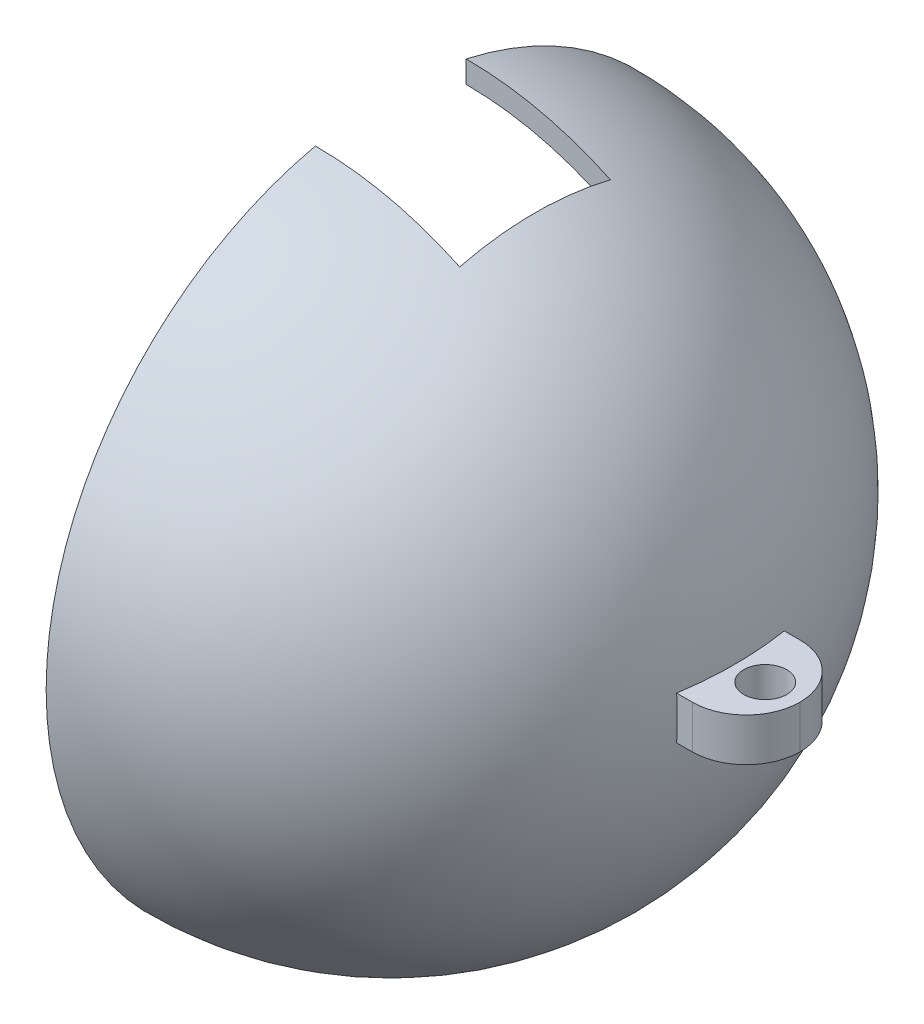
ISO-10303-21;
HEADER;
FILE_DESCRIPTION(('STEP AP214'),'2;1');
FILE_NAME('part.step','',(''),(''),'','','');
FILE_SCHEMA(('AUTOMOTIVE_DESIGN { 1 0 10303 214 1 1 1 1 }'));
ENDSEC;
DATA;
#1=APPLICATION_CONTEXT('core data for automotive mechanical design processes');
#2=APPLICATION_PROTOCOL_DEFINITION('international standard','automotive_design',2000,#1);
#3=PRODUCT_CONTEXT('',#1,'mechanical');
#4=PRODUCT('Part','Part','',(#3));
#5=PRODUCT_RELATED_PRODUCT_CATEGORY('part','',(#4));
#6=PRODUCT_DEFINITION_FORMATION('','',#4);
#7=PRODUCT_DEFINITION_CONTEXT('part definition',#1,'design');
#8=PRODUCT_DEFINITION('design','',#6,#7);
#9=PRODUCT_DEFINITION_SHAPE('','',#8);
#10=(LENGTH_UNIT() NAMED_UNIT(*) SI_UNIT(.MILLI.,.METRE.));
#11=(NAMED_UNIT(*) PLANE_ANGLE_UNIT() SI_UNIT($,.RADIAN.));
#12=(NAMED_UNIT(*) SI_UNIT($,.STERADIAN.) SOLID_ANGLE_UNIT());
#13=UNCERTAINTY_MEASURE_WITH_UNIT(LENGTH_MEASURE(1.E-05),#10,'distance_accuracy_value','');
#14=(GEOMETRIC_REPRESENTATION_CONTEXT(3) GLOBAL_UNCERTAINTY_ASSIGNED_CONTEXT((#13)) GLOBAL_UNIT_ASSIGNED_CONTEXT((#10,
#11,#12)) REPRESENTATION_CONTEXT('',''));
#15=CARTESIAN_POINT('',(0.,0.,0.));
#16=DIRECTION('',(0.,0.,1.));
#17=DIRECTION('',(1.,0.,0.));
#18=AXIS2_PLACEMENT_3D('',#15,#16,#17);
#19=CARTESIAN_POINT('',(0.,0.,0.));
#20=DIRECTION('',(0.,0.,1.));
#21=DIRECTION('',(0.,-1.,0.));
#22=AXIS2_PLACEMENT_3D('',#19,#20,#21);
#23=SPHERICAL_SURFACE('',#22,16.);
#24=CARTESIAN_POINT('',(0.,0.,0.));
#25=DIRECTION('',(-1.,0.,0.));
#26=DIRECTION('',(0.,0.,-1.));
#27=AXIS2_PLACEMENT_3D('',#24,#25,#26);
#28=CIRCLE('',#27,16.);
#29=CARTESIAN_POINT('',(0.,15.612494995996,-3.5));
#30=VERTEX_POINT('',#29);
#31=CARTESIAN_POINT('',(0.,15.612494995996,3.5));
#32=VERTEX_POINT('',#31);
#33=EDGE_CURVE('E131',#30,#32,#28,.T.);
#34=ORIENTED_EDGE('',*,*,#33,.F.);
#35=CARTESIAN_POINT('',(0.,0.,-3.5));
#36=DIRECTION('',(0.,0.,-1.));
#37=DIRECTION('',(-1.,0.,0.));
#38=AXIS2_PLACEMENT_3D('',#35,#36,#37);
#39=CIRCLE('',#38,15.612494995996);
#40=CARTESIAN_POINT('',(6.7,14.1017729381805,-3.5));
#41=VERTEX_POINT('',#40);
#42=EDGE_CURVE('E197',#30,#41,#39,.T.);
#43=ORIENTED_EDGE('',*,*,#42,.T.);
#44=CARTESIAN_POINT('',(6.7,0.,0.));
#45=DIRECTION('',(1.,0.,0.));
#46=DIRECTION('',(0.,0.,-1.));
#47=AXIS2_PLACEMENT_3D('',#44,#45,#46);
#48=CIRCLE('',#47,14.5296249091296);
#49=CARTESIAN_POINT('',(6.7,14.1017729381805,3.5));
#50=VERTEX_POINT('',#49);
#51=EDGE_CURVE('E132',#41,#50,#48,.T.);
#52=ORIENTED_EDGE('',*,*,#51,.T.);
#53=CARTESIAN_POINT('',(0.,0.,3.5));
#54=DIRECTION('',(0.,0.,1.));
#55=DIRECTION('',(1.,0.,0.));
#56=AXIS2_PLACEMENT_3D('',#53,#54,#55);
#57=CIRCLE('',#56,15.612494995996);
#58=EDGE_CURVE('E117',#50,#32,#57,.T.);
#59=ORIENTED_EDGE('',*,*,#58,.T.);
#60=EDGE_LOOP('',(#34,#43,#52,#59));
#61=FACE_BOUND('',#60,.T.);
#62=CARTESIAN_POINT('',(0.,0.,-2.5));
#63=DIRECTION('',(0.,0.,1.));
#64=DIRECTION('',(1.,0.,0.));
#65=AXIS2_PLACEMENT_3D('',#62,#63,#64);
#66=CIRCLE('',#65,15.8034806292791);
#67=CARTESIAN_POINT('',(15.7718102955875,-1.,-2.5));
#68=VERTEX_POINT('',#67);
#69=CARTESIAN_POINT('',(15.7718102955875,1.,-2.5));
#70=VERTEX_POINT('',#69);
#71=EDGE_CURVE('E161',#68,#70,#66,.T.);
#72=ORIENTED_EDGE('',*,*,#71,.F.);
#73=CARTESIAN_POINT('',(0.,-1.,0.));
#74=DIRECTION('',(0.,1.,0.));
#75=DIRECTION('',(0.,0.,1.));
#76=AXIS2_PLACEMENT_3D('',#73,#74,#75);
#77=CIRCLE('',#76,15.9687194226713);
#78=CARTESIAN_POINT('',(15.7718102955875,-1.,2.5));
#79=VERTEX_POINT('',#78);
#80=EDGE_CURVE('E144',#79,#68,#77,.T.);
#81=ORIENTED_EDGE('',*,*,#80,.F.);
#82=CARTESIAN_POINT('',(0.,0.,2.5));
#83=DIRECTION('',(0.,0.,-1.));
#84=DIRECTION('',(-1.,0.,0.));
#85=AXIS2_PLACEMENT_3D('',#82,#83,#84);
#86=CIRCLE('',#85,15.8034806292791);
#87=CARTESIAN_POINT('',(15.7718102955875,1.,2.5));
#88=VERTEX_POINT('',#87);
#89=EDGE_CURVE('E153',#88,#79,#86,.T.);
#90=ORIENTED_EDGE('',*,*,#89,.F.);
#91=CARTESIAN_POINT('',(0.,1.,0.));
#92=DIRECTION('',(0.,-1.,0.));
#93=DIRECTION('',(0.,0.,-1.));
#94=AXIS2_PLACEMENT_3D('',#91,#92,#93);
#95=CIRCLE('',#94,15.9687194226713);
#96=EDGE_CURVE('E157',#70,#88,#95,.T.);
#97=ORIENTED_EDGE('',*,*,#96,.F.);
#98=EDGE_LOOP('',(#72,#81,#90,#97));
#99=FACE_BOUND('',#98,.T.);
#100=ADVANCED_FACE('F40',(#61,#99),#23,.T.);
#101=CARTESIAN_POINT('',(0.,0.,0.));
#102=DIRECTION('',(0.,0.,1.));
#103=DIRECTION('',(0.,-1.,0.));
#104=AXIS2_PLACEMENT_3D('',#101,#102,#103);
#105=SPHERICAL_SURFACE('',#104,15.);
#106=CARTESIAN_POINT('',(15.,0.,0.));
#107=VERTEX_POINT('',#106);
#108=VERTEX_LOOP('',#107);
#109=FACE_BOUND('',#108,.T.);
#110=CARTESIAN_POINT('',(6.7,0.,0.));
#111=DIRECTION('',(1.,0.,0.));
#112=DIRECTION('',(0.,0.,-1.));
#113=AXIS2_PLACEMENT_3D('',#110,#111,#112);
#114=CIRCLE('',#113,13.4205066968427);
#115=CARTESIAN_POINT('',(6.7,12.9560796539694,3.5));
#116=VERTEX_POINT('',#115);
#117=CARTESIAN_POINT('',(6.7,12.9560796539694,-3.5));
#118=VERTEX_POINT('',#117);
#119=EDGE_CURVE('E12',#116,#118,#114,.F.);
#120=ORIENTED_EDGE('',*,*,#119,.T.);
#121=CARTESIAN_POINT('',(0.,0.,-3.5));
#122=DIRECTION('',(0.,0.,-1.));
#123=DIRECTION('',(-1.,0.,0.));
#124=AXIS2_PLACEMENT_3D('',#121,#122,#123);
#125=CIRCLE('',#124,14.5859521458148);
#126=CARTESIAN_POINT('',(0.,14.5859521458148,-3.5));
#127=VERTEX_POINT('',#126);
#128=EDGE_CURVE('E134',#118,#127,#125,.F.);
#129=ORIENTED_EDGE('',*,*,#128,.T.);
#130=CARTESIAN_POINT('',(0.,0.,0.));
#131=DIRECTION('',(1.,0.,0.));
#132=DIRECTION('',(0.,0.,-1.));
#133=AXIS2_PLACEMENT_3D('',#130,#131,#132);
#134=CIRCLE('',#133,15.);
#135=CARTESIAN_POINT('',(1.01853159452743E-13,14.5859521458148,3.5));
#136=VERTEX_POINT('',#135);
#137=EDGE_CURVE('E139',#136,#127,#134,.T.);
#138=ORIENTED_EDGE('',*,*,#137,.F.);
#139=CARTESIAN_POINT('',(0.,0.,3.5));
#140=DIRECTION('',(0.,0.,1.));
#141=DIRECTION('',(1.,0.,0.));
#142=AXIS2_PLACEMENT_3D('',#139,#140,#141);
#143=CIRCLE('',#142,14.5859521458148);
#144=EDGE_CURVE('E56',#136,#116,#143,.F.);
#145=ORIENTED_EDGE('',*,*,#144,.T.);
#146=EDGE_LOOP('',(#120,#129,#138,#145));
#147=FACE_BOUND('',#146,.T.);
#148=ADVANCED_FACE('F199',(#109,#147),#105,.F.);
#149=CARTESIAN_POINT('',(0.,0.,0.));
#150=DIRECTION('',(-1.,0.,0.));
#151=DIRECTION('',(0.,0.,-1.));
#152=AXIS2_PLACEMENT_3D('',#149,#150,#151);
#153=PLANE('',#152);
#154=DIRECTION('',(0.,-1.,0.));
#155=VECTOR('',#154,1.);
#156=CARTESIAN_POINT('',(0.,0.,-3.5));
#157=LINE('',#156,#155);
#158=EDGE_CURVE('E49',#30,#127,#157,.T.);
#159=ORIENTED_EDGE('',*,*,#158,.F.);
#160=ORIENTED_EDGE('',*,*,#33,.T.);
#161=DIRECTION('',(0.,1.,0.));
#162=VECTOR('',#161,1.);
#163=CARTESIAN_POINT('',(0.,0.,3.5));
#164=LINE('',#163,#162);
#165=EDGE_CURVE('E114',#136,#32,#164,.T.);
#166=ORIENTED_EDGE('',*,*,#165,.F.);
#167=ORIENTED_EDGE('',*,*,#137,.T.);
#168=EDGE_LOOP('',(#159,#160,#166,#167));
#169=FACE_BOUND('',#168,.T.);
#170=ADVANCED_FACE('F137',(#169),#153,.T.);
#171=CARTESIAN_POINT('',(19.,-1.,-2.5));
#172=DIRECTION('',(0.,0.,1.));
#173=DIRECTION('',(1.,0.,0.));
#174=AXIS2_PLACEMENT_3D('',#171,#172,#173);
#175=PLANE('',#174);
#176=DIRECTION('',(-1.,0.,0.));
#177=VECTOR('',#176,1.);
#178=CARTESIAN_POINT('',(19.,1.,-2.5));
#179=LINE('',#178,#177);
#180=CARTESIAN_POINT('',(16.5,1.,-2.5));
#181=VERTEX_POINT('',#180);
#182=EDGE_CURVE('E140',#181,#70,#179,.T.);
#183=ORIENTED_EDGE('',*,*,#182,.F.);
#184=DIRECTION('',(0.,1.,0.));
#185=VECTOR('',#184,1.);
#186=CARTESIAN_POINT('',(16.5,-1.,-2.5));
#187=LINE('',#186,#185);
#188=CARTESIAN_POINT('',(16.5,-1.,-2.5));
#189=VERTEX_POINT('',#188);
#190=EDGE_CURVE('E178',#181,#189,#187,.F.);
#191=ORIENTED_EDGE('',*,*,#190,.T.);
#192=DIRECTION('',(-1.,0.,0.));
#193=VECTOR('',#192,1.);
#194=CARTESIAN_POINT('',(19.,-1.,-2.5));
#195=LINE('',#194,#193);
#196=EDGE_CURVE('E170',#189,#68,#195,.T.);
#197=ORIENTED_EDGE('',*,*,#196,.T.);
#198=ORIENTED_EDGE('',*,*,#71,.T.);
#199=EDGE_LOOP('',(#183,#191,#197,#198));
#200=FACE_BOUND('',#199,.T.);
#201=ADVANCED_FACE('F228',(#200),#175,.F.);
#202=CARTESIAN_POINT('',(19.,1.,2.5));
#203=DIRECTION('',(0.,-1.,0.));
#204=DIRECTION('',(0.,0.,-1.));
#205=AXIS2_PLACEMENT_3D('',#202,#203,#204);
#206=PLANE('',#205);
#207=CARTESIAN_POINT('',(17.3859051477937,1.,0.));
#208=DIRECTION('',(0.,1.,0.));
#209=DIRECTION('',(0.,0.,1.));
#210=AXIS2_PLACEMENT_3D('',#207,#208,#209);
#211=CIRCLE('',#210,1.);
#212=CARTESIAN_POINT('',(17.3859051477937,1.,1.));
#213=VERTEX_POINT('',#212);
#214=EDGE_CURVE('E171',#213,#213,#211,.T.);
#215=ORIENTED_EDGE('',*,*,#214,.F.);
#216=EDGE_LOOP('',(#215));
#217=FACE_BOUND('',#216,.T.);
#218=DIRECTION('',(-1.,0.,0.));
#219=VECTOR('',#218,1.);
#220=CARTESIAN_POINT('',(19.,1.,2.5));
#221=LINE('',#220,#219);
#222=CARTESIAN_POINT('',(16.5,1.,2.5));
#223=VERTEX_POINT('',#222);
#224=EDGE_CURVE('E146',#223,#88,#221,.T.);
#225=ORIENTED_EDGE('',*,*,#224,.F.);
#226=CARTESIAN_POINT('',(16.5,1.,0.));
#227=DIRECTION('',(0.,-1.,0.));
#228=DIRECTION('',(0.,0.,-1.));
#229=AXIS2_PLACEMENT_3D('',#226,#227,#228);
#230=CIRCLE('',#229,2.5);
#231=CARTESIAN_POINT('',(19.,1.,0.));
#232=VERTEX_POINT('',#231);
#233=EDGE_CURVE('E124',#223,#232,#230,.F.);
#234=ORIENTED_EDGE('',*,*,#233,.T.);
#235=CARTESIAN_POINT('',(16.5,1.,0.));
#236=DIRECTION('',(0.,-1.,0.));
#237=DIRECTION('',(0.,0.,-1.));
#238=AXIS2_PLACEMENT_3D('',#235,#236,#237);
#239=CIRCLE('',#238,2.5);
#240=EDGE_CURVE('E175',#232,#181,#239,.F.);
#241=ORIENTED_EDGE('',*,*,#240,.T.);
#242=ORIENTED_EDGE('',*,*,#182,.T.);
#243=ORIENTED_EDGE('',*,*,#96,.T.);
#244=EDGE_LOOP('',(#225,#234,#241,#242,#243));
#245=FACE_BOUND('',#244,.T.);
#246=ADVANCED_FACE('F223',(#217,#245),#206,.F.);
#247=CARTESIAN_POINT('',(19.,-1.,2.5));
#248=DIRECTION('',(0.,0.,-1.));
#249=DIRECTION('',(-1.,0.,0.));
#250=AXIS2_PLACEMENT_3D('',#247,#248,#249);
#251=PLANE('',#250);
#252=DIRECTION('',(-1.,0.,0.));
#253=VECTOR('',#252,1.);
#254=CARTESIAN_POINT('',(19.,-1.,2.5));
#255=LINE('',#254,#253);
#256=CARTESIAN_POINT('',(16.5,-1.,2.5));
#257=VERTEX_POINT('',#256);
#258=EDGE_CURVE('E213',#257,#79,#255,.T.);
#259=ORIENTED_EDGE('',*,*,#258,.F.);
#260=DIRECTION('',(0.,-1.,0.));
#261=VECTOR('',#260,1.);
#262=CARTESIAN_POINT('',(16.5,-1.,2.5));
#263=LINE('',#262,#261);
#264=EDGE_CURVE('E64',#257,#223,#263,.F.);
#265=ORIENTED_EDGE('',*,*,#264,.T.);
#266=ORIENTED_EDGE('',*,*,#224,.T.);
#267=ORIENTED_EDGE('',*,*,#89,.T.);
#268=EDGE_LOOP('',(#259,#265,#266,#267));
#269=FACE_BOUND('',#268,.T.);
#270=ADVANCED_FACE('F217',(#269),#251,.F.);
#271=CARTESIAN_POINT('',(19.,-1.,2.5));
#272=DIRECTION('',(0.,1.,0.));
#273=DIRECTION('',(0.,0.,1.));
#274=AXIS2_PLACEMENT_3D('',#271,#272,#273);
#275=PLANE('',#274);
#276=CARTESIAN_POINT('',(17.3859051477937,-1.,0.));
#277=DIRECTION('',(0.,1.,0.));
#278=DIRECTION('',(0.,0.,1.));
#279=AXIS2_PLACEMENT_3D('',#276,#277,#278);
#280=CIRCLE('',#279,1.);
#281=CARTESIAN_POINT('',(17.3859051477937,-1.,1.));
#282=VERTEX_POINT('',#281);
#283=EDGE_CURVE('E166',#282,#282,#280,.T.);
#284=ORIENTED_EDGE('',*,*,#283,.T.);
#285=EDGE_LOOP('',(#284));
#286=FACE_BOUND('',#285,.T.);
#287=CARTESIAN_POINT('',(16.5,-1.,0.));
#288=DIRECTION('',(0.,1.,0.));
#289=DIRECTION('',(0.,0.,1.));
#290=AXIS2_PLACEMENT_3D('',#287,#288,#289);
#291=CIRCLE('',#290,2.5);
#292=CARTESIAN_POINT('',(19.,-1.,0.));
#293=VERTEX_POINT('',#292);
#294=EDGE_CURVE('E181',#189,#293,#291,.F.);
#295=ORIENTED_EDGE('',*,*,#294,.T.);
#296=CARTESIAN_POINT('',(16.5,-1.,0.));
#297=DIRECTION('',(0.,1.,0.));
#298=DIRECTION('',(0.,0.,1.));
#299=AXIS2_PLACEMENT_3D('',#296,#297,#298);
#300=CIRCLE('',#299,2.5);
#301=EDGE_CURVE('E185',#293,#257,#300,.F.);
#302=ORIENTED_EDGE('',*,*,#301,.T.);
#303=ORIENTED_EDGE('',*,*,#258,.T.);
#304=ORIENTED_EDGE('',*,*,#80,.T.);
#305=ORIENTED_EDGE('',*,*,#196,.F.);
#306=EDGE_LOOP('',(#295,#302,#303,#304,#305));
#307=FACE_BOUND('',#306,.T.);
#308=ADVANCED_FACE('F235',(#286,#307),#275,.F.);
#309=CARTESIAN_POINT('',(17.3859051477937,-4.,0.));
#310=DIRECTION('',(0.,1.,0.));
#311=DIRECTION('',(0.,0.,1.));
#312=AXIS2_PLACEMENT_3D('',#309,#310,#311);
#313=CYLINDRICAL_SURFACE('',#312,1.);
#314=ORIENTED_EDGE('',*,*,#214,.T.);
#315=EDGE_LOOP('',(#314));
#316=FACE_BOUND('',#315,.T.);
#317=ORIENTED_EDGE('',*,*,#283,.F.);
#318=EDGE_LOOP('',(#317));
#319=FACE_BOUND('',#318,.T.);
#320=ADVANCED_FACE('F245',(#316,#319),#313,.F.);
#321=CARTESIAN_POINT('',(16.5,0.,0.));
#322=DIRECTION('',(0.,1.,0.));
#323=DIRECTION('',(0.,0.,1.));
#324=AXIS2_PLACEMENT_3D('',#321,#322,#323);
#325=CYLINDRICAL_SURFACE('',#324,2.5);
#326=ORIENTED_EDGE('',*,*,#294,.F.);
#327=ORIENTED_EDGE('',*,*,#190,.F.);
#328=ORIENTED_EDGE('',*,*,#240,.F.);
#329=DIRECTION('',(0.,1.,0.));
#330=VECTOR('',#329,1.);
#331=CARTESIAN_POINT('',(19.,0.,0.));
#332=LINE('',#331,#330);
#333=EDGE_CURVE('E165',#293,#232,#332,.T.);
#334=ORIENTED_EDGE('',*,*,#333,.F.);
#335=EDGE_LOOP('',(#326,#327,#328,#334));
#336=FACE_BOUND('',#335,.T.);
#337=ADVANCED_FACE('F232',(#336),#325,.T.);
#338=CARTESIAN_POINT('',(16.5,0.,0.));
#339=DIRECTION('',(0.,-1.,0.));
#340=DIRECTION('',(0.,0.,-1.));
#341=AXIS2_PLACEMENT_3D('',#338,#339,#340);
#342=CYLINDRICAL_SURFACE('',#341,2.5);
#343=ORIENTED_EDGE('',*,*,#233,.F.);
#344=ORIENTED_EDGE('',*,*,#264,.F.);
#345=ORIENTED_EDGE('',*,*,#301,.F.);
#346=ORIENTED_EDGE('',*,*,#333,.T.);
#347=EDGE_LOOP('',(#343,#344,#345,#346));
#348=FACE_BOUND('',#347,.T.);
#349=ADVANCED_FACE('F42',(#348),#342,.T.);
#350=CARTESIAN_POINT('',(6.7,3.62693102300545,-3.5));
#351=DIRECTION('',(1.,0.,0.));
#352=DIRECTION('',(0.,0.,-1.));
#353=AXIS2_PLACEMENT_3D('',#350,#351,#352);
#354=PLANE('',#353);
#355=DIRECTION('',(0.,1.,0.));
#356=VECTOR('',#355,1.);
#357=CARTESIAN_POINT('',(6.7,3.62693102300545,-3.5));
#358=LINE('',#357,#356);
#359=EDGE_CURVE('E352',#118,#41,#358,.T.);
#360=ORIENTED_EDGE('',*,*,#359,.F.);
#361=ORIENTED_EDGE('',*,*,#119,.F.);
#362=DIRECTION('',(0.,1.,0.));
#363=VECTOR('',#362,1.);
#364=CARTESIAN_POINT('',(6.7,3.62693102300545,3.5));
#365=LINE('',#364,#363);
#366=EDGE_CURVE('E354',#116,#50,#365,.T.);
#367=ORIENTED_EDGE('',*,*,#366,.T.);
#368=ORIENTED_EDGE('',*,*,#51,.F.);
#369=EDGE_LOOP('',(#360,#361,#367,#368));
#370=FACE_BOUND('',#369,.T.);
#371=ADVANCED_FACE('F238',(#370),#354,.F.);
#372=CARTESIAN_POINT('',(0.,3.62693102300545,-3.5));
#373=DIRECTION('',(0.,0.,-1.));
#374=DIRECTION('',(-1.,0.,0.));
#375=AXIS2_PLACEMENT_3D('',#372,#373,#374);
#376=PLANE('',#375);
#377=ORIENTED_EDGE('',*,*,#158,.T.);
#378=ORIENTED_EDGE('',*,*,#128,.F.);
#379=ORIENTED_EDGE('',*,*,#359,.T.);
#380=ORIENTED_EDGE('',*,*,#42,.F.);
#381=EDGE_LOOP('',(#377,#378,#379,#380));
#382=FACE_BOUND('',#381,.T.);
#383=ADVANCED_FACE('F194',(#382),#376,.F.);
#384=CARTESIAN_POINT('',(0.,3.62693102300545,3.5));
#385=DIRECTION('',(0.,0.,1.));
#386=DIRECTION('',(1.,0.,0.));
#387=AXIS2_PLACEMENT_3D('',#384,#385,#386);
#388=PLANE('',#387);
#389=ORIENTED_EDGE('',*,*,#366,.F.);
#390=ORIENTED_EDGE('',*,*,#144,.F.);
#391=ORIENTED_EDGE('',*,*,#165,.T.);
#392=ORIENTED_EDGE('',*,*,#58,.F.);
#393=EDGE_LOOP('',(#389,#390,#391,#392));
#394=FACE_BOUND('',#393,.T.);
#395=ADVANCED_FACE('F116',(#394),#388,.F.);
#396=CLOSED_SHELL('',(#100,#148,#170,#201,#246,#270,#308,#320,#337,#349,#371,#383,#395));
#397=MANIFOLD_SOLID_BREP('B2',#396);
#398=ADVANCED_BREP_SHAPE_REPRESENTATION('',(#18,#397),#14);
#399=SHAPE_DEFINITION_REPRESENTATION(#9,#398);
ENDSEC;
END-ISO-10303-21;
